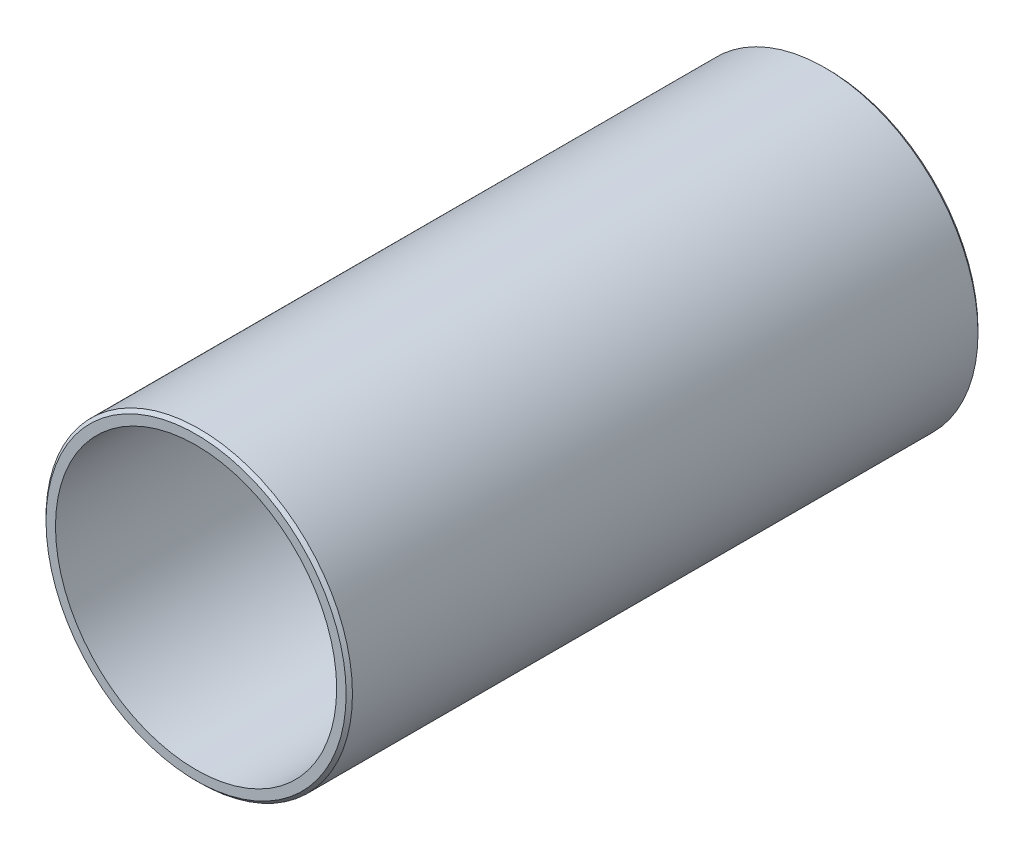
ISO-10303-21;
HEADER;
FILE_DESCRIPTION(('STEP AP214'),'2;1');
FILE_NAME('part.step','',(''),(''),'','','');
FILE_SCHEMA(('AUTOMOTIVE_DESIGN { 1 0 10303 214 1 1 1 1 }'));
ENDSEC;
DATA;
#1=APPLICATION_CONTEXT('core data for automotive mechanical design processes');
#2=APPLICATION_PROTOCOL_DEFINITION('international standard','automotive_design',2000,#1);
#3=PRODUCT_CONTEXT('',#1,'mechanical');
#4=PRODUCT('Part','Part','',(#3));
#5=PRODUCT_RELATED_PRODUCT_CATEGORY('part','',(#4));
#6=PRODUCT_DEFINITION_FORMATION('','',#4);
#7=PRODUCT_DEFINITION_CONTEXT('part definition',#1,'design');
#8=PRODUCT_DEFINITION('design','',#6,#7);
#9=PRODUCT_DEFINITION_SHAPE('','',#8);
#10=(LENGTH_UNIT() NAMED_UNIT(*) SI_UNIT(.MILLI.,.METRE.));
#11=(NAMED_UNIT(*) PLANE_ANGLE_UNIT() SI_UNIT($,.RADIAN.));
#12=(NAMED_UNIT(*) SI_UNIT($,.STERADIAN.) SOLID_ANGLE_UNIT());
#13=UNCERTAINTY_MEASURE_WITH_UNIT(LENGTH_MEASURE(1.E-05),#10,'distance_accuracy_value','');
#14=(GEOMETRIC_REPRESENTATION_CONTEXT(3) GLOBAL_UNCERTAINTY_ASSIGNED_CONTEXT((#13)) GLOBAL_UNIT_ASSIGNED_CONTEXT((#10,
#11,#12)) REPRESENTATION_CONTEXT('',''));
#15=CARTESIAN_POINT('',(0.,0.,0.));
#16=DIRECTION('',(0.,0.,1.));
#17=DIRECTION('',(1.,0.,0.));
#18=AXIS2_PLACEMENT_3D('',#15,#16,#17);
#19=CARTESIAN_POINT('',(0.,0.,200.));
#20=DIRECTION('',(0.,0.,1.));
#21=DIRECTION('',(1.,0.,0.));
#22=AXIS2_PLACEMENT_3D('',#19,#20,#21);
#23=PLANE('',#22);
#24=CARTESIAN_POINT('',(0.,0.,200.));
#25=DIRECTION('',(0.,0.,1.));
#26=DIRECTION('',(1.,0.,0.));
#27=AXIS2_PLACEMENT_3D('',#24,#25,#26);
#28=CIRCLE('',#27,95.);
#29=CARTESIAN_POINT('',(95.,0.,200.));
#30=VERTEX_POINT('',#29);
#31=EDGE_CURVE('E10',#30,#30,#28,.T.);
#32=ORIENTED_EDGE('',*,*,#31,.T.);
#33=EDGE_LOOP('',(#32));
#34=FACE_BOUND('',#33,.T.);
#35=CARTESIAN_POINT('',(0.,0.,200.));
#36=DIRECTION('',(0.,0.,1.));
#37=DIRECTION('',(1.,0.,0.));
#38=AXIS2_PLACEMENT_3D('',#35,#36,#37);
#39=CIRCLE('',#38,89.);
#40=CARTESIAN_POINT('',(89.,0.,200.));
#41=VERTEX_POINT('',#40);
#42=EDGE_CURVE('E52',#41,#41,#39,.T.);
#43=ORIENTED_EDGE('',*,*,#42,.F.);
#44=EDGE_LOOP('',(#43));
#45=FACE_BOUND('',#44,.T.);
#46=ADVANCED_FACE('F32',(#34,#45),#23,.T.);
#47=CARTESIAN_POINT('',(0.,0.,-200.));
#48=DIRECTION('',(0.,0.,1.));
#49=DIRECTION('',(1.,0.,0.));
#50=AXIS2_PLACEMENT_3D('',#47,#48,#49);
#51=PLANE('',#50);
#52=CARTESIAN_POINT('',(0.,0.,-200.));
#53=DIRECTION('',(0.,0.,1.));
#54=DIRECTION('',(1.,0.,0.));
#55=AXIS2_PLACEMENT_3D('',#52,#53,#54);
#56=CIRCLE('',#55,94.9999999999999);
#57=CARTESIAN_POINT('',(94.9999999999999,0.,-200.));
#58=VERTEX_POINT('',#57);
#59=EDGE_CURVE('E39',#58,#58,#56,.F.);
#60=ORIENTED_EDGE('',*,*,#59,.T.);
#61=EDGE_LOOP('',(#60));
#62=FACE_BOUND('',#61,.T.);
#63=CARTESIAN_POINT('',(0.,0.,-200.));
#64=DIRECTION('',(0.,0.,1.));
#65=DIRECTION('',(1.,0.,0.));
#66=AXIS2_PLACEMENT_3D('',#63,#64,#65);
#67=CIRCLE('',#66,89.);
#68=CARTESIAN_POINT('',(89.,0.,-200.));
#69=VERTEX_POINT('',#68);
#70=EDGE_CURVE('E53',#69,#69,#67,.T.);
#71=ORIENTED_EDGE('',*,*,#70,.T.);
#72=EDGE_LOOP('',(#71));
#73=FACE_BOUND('',#72,.T.);
#74=ADVANCED_FACE('F63',(#62,#73),#51,.F.);
#75=CARTESIAN_POINT('',(0.,0.,200.));
#76=DIRECTION('',(0.,0.,-1.));
#77=DIRECTION('',(-1.,0.,0.));
#78=AXIS2_PLACEMENT_3D('',#75,#76,#77);
#79=CYLINDRICAL_SURFACE('',#78,97.);
#80=CARTESIAN_POINT('',(0.,0.,-198.));
#81=DIRECTION('',(0.,0.,1.));
#82=DIRECTION('',(1.,0.,0.));
#83=AXIS2_PLACEMENT_3D('',#80,#81,#82);
#84=CIRCLE('',#83,97.);
#85=CARTESIAN_POINT('',(97.,0.,-198.));
#86=VERTEX_POINT('',#85);
#87=EDGE_CURVE('E43',#86,#86,#84,.T.);
#88=ORIENTED_EDGE('',*,*,#87,.T.);
#89=EDGE_LOOP('',(#88));
#90=FACE_BOUND('',#89,.T.);
#91=CARTESIAN_POINT('',(0.,0.,198.));
#92=DIRECTION('',(0.,0.,1.));
#93=DIRECTION('',(1.,0.,0.));
#94=AXIS2_PLACEMENT_3D('',#91,#92,#93);
#95=CIRCLE('',#94,97.);
#96=CARTESIAN_POINT('',(97.,0.,198.));
#97=VERTEX_POINT('',#96);
#98=EDGE_CURVE('E47',#97,#97,#95,.F.);
#99=ORIENTED_EDGE('',*,*,#98,.T.);
#100=EDGE_LOOP('',(#99));
#101=FACE_BOUND('',#100,.T.);
#102=ADVANCED_FACE('F68',(#90,#101),#79,.T.);
#103=CARTESIAN_POINT('',(0.,0.,200.));
#104=DIRECTION('',(0.,0.,-1.));
#105=DIRECTION('',(-1.,0.,0.));
#106=AXIS2_PLACEMENT_3D('',#103,#104,#105);
#107=CYLINDRICAL_SURFACE('',#106,89.);
#108=ORIENTED_EDGE('',*,*,#42,.T.);
#109=EDGE_LOOP('',(#108));
#110=FACE_BOUND('',#109,.T.);
#111=ORIENTED_EDGE('',*,*,#70,.F.);
#112=EDGE_LOOP('',(#111));
#113=FACE_BOUND('',#112,.T.);
#114=ADVANCED_FACE('F59',(#110,#113),#107,.F.);
#115=CARTESIAN_POINT('',(0.,0.,-198.));
#116=DIRECTION('',(0.,0.,1.));
#117=DIRECTION('',(1.,0.,0.));
#118=AXIS2_PLACEMENT_3D('',#115,#116,#117);
#119=CONICAL_SURFACE('',#118,97.,0.785398163397448);
#120=ORIENTED_EDGE('',*,*,#59,.F.);
#121=EDGE_LOOP('',(#120));
#122=FACE_BOUND('',#121,.T.);
#123=ORIENTED_EDGE('',*,*,#87,.F.);
#124=EDGE_LOOP('',(#123));
#125=FACE_BOUND('',#124,.T.);
#126=ADVANCED_FACE('F74',(#122,#125),#119,.T.);
#127=CARTESIAN_POINT('',(0.,0.,200.));
#128=DIRECTION('',(0.,0.,-1.));
#129=DIRECTION('',(-1.,0.,0.));
#130=AXIS2_PLACEMENT_3D('',#127,#128,#129);
#131=CONICAL_SURFACE('',#130,95.,0.785398163397455);
#132=ORIENTED_EDGE('',*,*,#98,.F.);
#133=EDGE_LOOP('',(#132));
#134=FACE_BOUND('',#133,.T.);
#135=ORIENTED_EDGE('',*,*,#31,.F.);
#136=EDGE_LOOP('',(#135));
#137=FACE_BOUND('',#136,.T.);
#138=ADVANCED_FACE('F34',(#134,#137),#131,.T.);
#139=CLOSED_SHELL('',(#46,#74,#102,#114,#126,#138));
#140=MANIFOLD_SOLID_BREP('B2',#139);
#141=ADVANCED_BREP_SHAPE_REPRESENTATION('',(#18,#140),#14);
#142=SHAPE_DEFINITION_REPRESENTATION(#9,#141);
ENDSEC;
END-ISO-10303-21;
